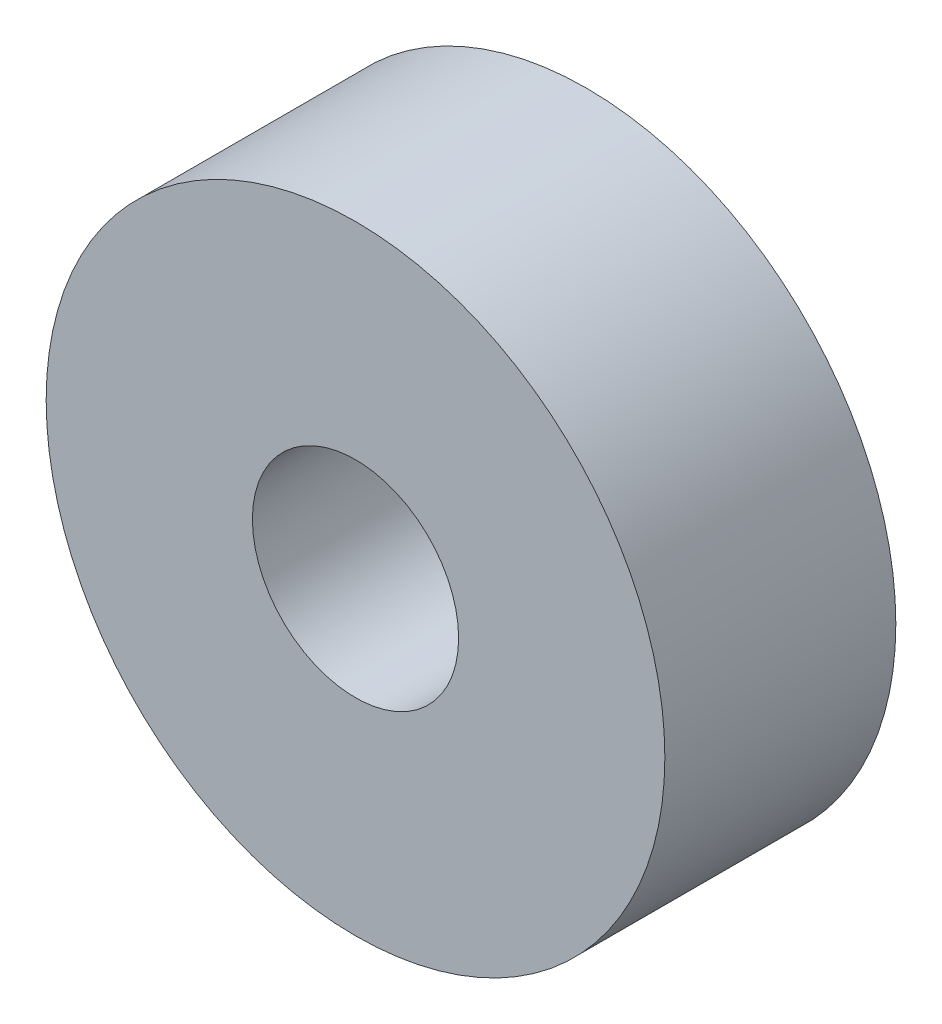
ISO-10303-21;
HEADER;
FILE_DESCRIPTION(('STEP AP214'),'2;1');
FILE_NAME('part.step','',(''),(''),'','','');
FILE_SCHEMA(('AUTOMOTIVE_DESIGN { 1 0 10303 214 1 1 1 1 }'));
ENDSEC;
DATA;
#1=APPLICATION_CONTEXT('core data for automotive mechanical design processes');
#2=APPLICATION_PROTOCOL_DEFINITION('international standard','automotive_design',2000,#1);
#3=PRODUCT_CONTEXT('',#1,'mechanical');
#4=PRODUCT('Part','Part','',(#3));
#5=PRODUCT_RELATED_PRODUCT_CATEGORY('part','',(#4));
#6=PRODUCT_DEFINITION_FORMATION('','',#4);
#7=PRODUCT_DEFINITION_CONTEXT('part definition',#1,'design');
#8=PRODUCT_DEFINITION('design','',#6,#7);
#9=PRODUCT_DEFINITION_SHAPE('','',#8);
#10=(LENGTH_UNIT() NAMED_UNIT(*) SI_UNIT(.MILLI.,.METRE.));
#11=(NAMED_UNIT(*) PLANE_ANGLE_UNIT() SI_UNIT($,.RADIAN.));
#12=(NAMED_UNIT(*) SI_UNIT($,.STERADIAN.) SOLID_ANGLE_UNIT());
#13=UNCERTAINTY_MEASURE_WITH_UNIT(LENGTH_MEASURE(1.E-05),#10,'distance_accuracy_value','');
#14=(GEOMETRIC_REPRESENTATION_CONTEXT(3) GLOBAL_UNCERTAINTY_ASSIGNED_CONTEXT((#13)) GLOBAL_UNIT_ASSIGNED_CONTEXT((#10,
#11,#12)) REPRESENTATION_CONTEXT('',''));
#15=CARTESIAN_POINT('',(0.,0.,0.));
#16=DIRECTION('',(0.,0.,1.));
#17=DIRECTION('',(1.,0.,0.));
#18=AXIS2_PLACEMENT_3D('',#15,#16,#17);
#19=CARTESIAN_POINT('',(0.,0.,7.112));
#20=DIRECTION('',(0.,0.,1.));
#21=DIRECTION('',(1.,0.,0.));
#22=AXIS2_PLACEMENT_3D('',#19,#20,#21);
#23=PLANE('',#22);
#24=CARTESIAN_POINT('',(0.,0.,7.112));
#25=DIRECTION('',(0.,0.,1.));
#26=DIRECTION('',(1.,0.,0.));
#27=AXIS2_PLACEMENT_3D('',#24,#25,#26);
#28=CIRCLE('',#27,9.525);
#29=CARTESIAN_POINT('',(9.525,0.,7.112));
#30=VERTEX_POINT('',#29);
#31=EDGE_CURVE('E10',#30,#30,#28,.T.);
#32=ORIENTED_EDGE('',*,*,#31,.T.);
#33=EDGE_LOOP('',(#32));
#34=FACE_BOUND('',#33,.T.);
#35=CARTESIAN_POINT('',(0.,0.,7.112));
#36=DIRECTION('',(0.,0.,1.));
#37=DIRECTION('',(1.,0.,0.));
#38=AXIS2_PLACEMENT_3D('',#35,#36,#37);
#39=CIRCLE('',#38,3.175);
#40=CARTESIAN_POINT('',(3.175,0.,7.112));
#41=VERTEX_POINT('',#40);
#42=EDGE_CURVE('E52',#41,#41,#39,.T.);
#43=ORIENTED_EDGE('',*,*,#42,.F.);
#44=EDGE_LOOP('',(#43));
#45=FACE_BOUND('',#44,.T.);
#46=ADVANCED_FACE('F41',(#34,#45),#23,.T.);
#47=CARTESIAN_POINT('',(0.,0.,0.));
#48=DIRECTION('',(0.,0.,1.));
#49=DIRECTION('',(1.,0.,0.));
#50=AXIS2_PLACEMENT_3D('',#47,#48,#49);
#51=PLANE('',#50);
#52=CARTESIAN_POINT('',(0.,0.,0.));
#53=DIRECTION('',(0.,0.,1.));
#54=DIRECTION('',(1.,0.,0.));
#55=AXIS2_PLACEMENT_3D('',#52,#53,#54);
#56=CIRCLE('',#55,9.525);
#57=CARTESIAN_POINT('',(9.525,0.,0.));
#58=VERTEX_POINT('',#57);
#59=EDGE_CURVE('E45',#58,#58,#56,.T.);
#60=ORIENTED_EDGE('',*,*,#59,.F.);
#61=EDGE_LOOP('',(#60));
#62=FACE_BOUND('',#61,.T.);
#63=CARTESIAN_POINT('',(0.,0.,0.));
#64=DIRECTION('',(0.,0.,1.));
#65=DIRECTION('',(1.,0.,0.));
#66=AXIS2_PLACEMENT_3D('',#63,#64,#65);
#67=CIRCLE('',#66,3.175);
#68=CARTESIAN_POINT('',(3.175,0.,0.));
#69=VERTEX_POINT('',#68);
#70=EDGE_CURVE('E54',#69,#69,#67,.T.);
#71=ORIENTED_EDGE('',*,*,#70,.T.);
#72=EDGE_LOOP('',(#71));
#73=FACE_BOUND('',#72,.T.);
#74=ADVANCED_FACE('F64',(#62,#73),#51,.F.);
#75=CARTESIAN_POINT('',(0.,0.,7.112));
#76=DIRECTION('',(0.,0.,-1.));
#77=DIRECTION('',(-1.,0.,0.));
#78=AXIS2_PLACEMENT_3D('',#75,#76,#77);
#79=CYLINDRICAL_SURFACE('',#78,9.525);
#80=ORIENTED_EDGE('',*,*,#31,.F.);
#81=EDGE_LOOP('',(#80));
#82=FACE_BOUND('',#81,.T.);
#83=ORIENTED_EDGE('',*,*,#59,.T.);
#84=EDGE_LOOP('',(#83));
#85=FACE_BOUND('',#84,.T.);
#86=ADVANCED_FACE('F43',(#82,#85),#79,.T.);
#87=CARTESIAN_POINT('',(0.,0.,7.112));
#88=DIRECTION('',(0.,0.,-1.));
#89=DIRECTION('',(-1.,0.,0.));
#90=AXIS2_PLACEMENT_3D('',#87,#88,#89);
#91=CYLINDRICAL_SURFACE('',#90,3.175);
#92=ORIENTED_EDGE('',*,*,#42,.T.);
#93=EDGE_LOOP('',(#92));
#94=FACE_BOUND('',#93,.T.);
#95=ORIENTED_EDGE('',*,*,#70,.F.);
#96=EDGE_LOOP('',(#95));
#97=FACE_BOUND('',#96,.T.);
#98=ADVANCED_FACE('F60',(#94,#97),#91,.F.);
#99=CLOSED_SHELL('',(#46,#74,#86,#98));
#100=MANIFOLD_SOLID_BREP('B2',#99);
#101=ADVANCED_BREP_SHAPE_REPRESENTATION('',(#18,#100),#14);
#102=SHAPE_DEFINITION_REPRESENTATION(#9,#101);
ENDSEC;
END-ISO-10303-21;
